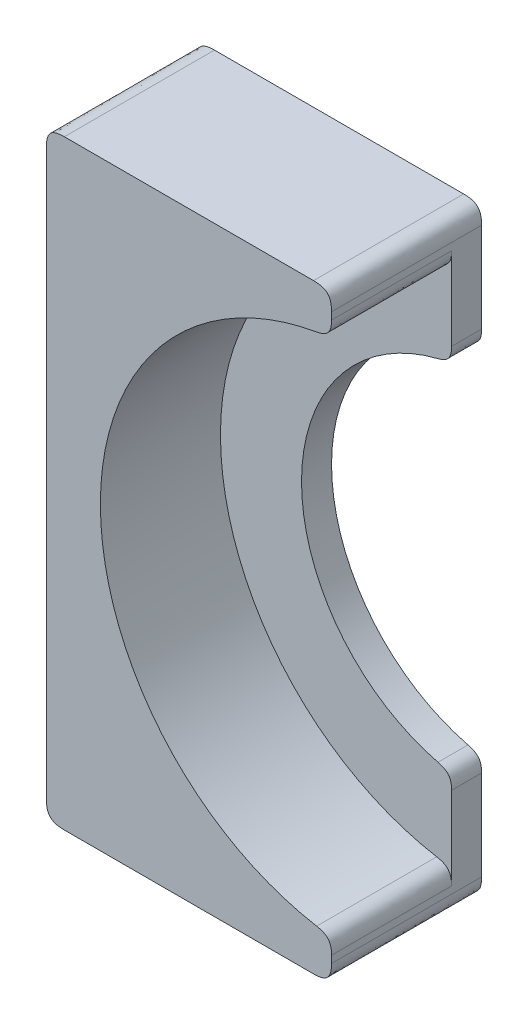
ISO-10303-21;
HEADER;
FILE_DESCRIPTION(('STEP AP214'),'2;1');
FILE_NAME('part.step','',(''),(''),'','','');
FILE_SCHEMA(('AUTOMOTIVE_DESIGN { 1 0 10303 214 1 1 1 1 }'));
ENDSEC;
DATA;
#1=APPLICATION_CONTEXT('core data for automotive mechanical design processes');
#2=APPLICATION_PROTOCOL_DEFINITION('international standard','automotive_design',2000,#1);
#3=PRODUCT_CONTEXT('',#1,'mechanical');
#4=PRODUCT('Part','Part','',(#3));
#5=PRODUCT_RELATED_PRODUCT_CATEGORY('part','',(#4));
#6=PRODUCT_DEFINITION_FORMATION('','',#4);
#7=PRODUCT_DEFINITION_CONTEXT('part definition',#1,'design');
#8=PRODUCT_DEFINITION('design','',#6,#7);
#9=PRODUCT_DEFINITION_SHAPE('','',#8);
#10=(LENGTH_UNIT() NAMED_UNIT(*) SI_UNIT(.MILLI.,.METRE.));
#11=(NAMED_UNIT(*) PLANE_ANGLE_UNIT() SI_UNIT($,.RADIAN.));
#12=(NAMED_UNIT(*) SI_UNIT($,.STERADIAN.) SOLID_ANGLE_UNIT());
#13=UNCERTAINTY_MEASURE_WITH_UNIT(LENGTH_MEASURE(1.E-05),#10,'distance_accuracy_value','');
#14=(GEOMETRIC_REPRESENTATION_CONTEXT(3) GLOBAL_UNCERTAINTY_ASSIGNED_CONTEXT((#13)) GLOBAL_UNIT_ASSIGNED_CONTEXT((#10,
#11,#12)) REPRESENTATION_CONTEXT('',''));
#15=CARTESIAN_POINT('',(0.,0.,0.));
#16=DIRECTION('',(0.,0.,1.));
#17=DIRECTION('',(1.,0.,0.));
#18=AXIS2_PLACEMENT_3D('',#15,#16,#17);
#19=CARTESIAN_POINT('',(0.,0.,25.));
#20=DIRECTION('',(0.,0.,-1.));
#21=DIRECTION('',(-1.,0.,0.));
#22=AXIS2_PLACEMENT_3D('',#19,#20,#21);
#23=CYLINDRICAL_SURFACE('',#22,43.5);
#24=CARTESIAN_POINT('',(0.,0.,5.));
#25=DIRECTION('',(0.,0.,1.));
#26=DIRECTION('',(1.,0.,0.));
#27=AXIS2_PLACEMENT_3D('',#24,#25,#26);
#28=CIRCLE('',#27,43.5);
#29=CARTESIAN_POINT('',(-7.48387096774193,42.85139058815,5.));
#30=VERTEX_POINT('',#29);
#31=CARTESIAN_POINT('',(-7.48387096774192,-42.85139058815,5.));
#32=VERTEX_POINT('',#31);
#33=EDGE_CURVE('E428',#30,#32,#28,.T.);
#34=ORIENTED_EDGE('',*,*,#33,.F.);
#35=CARTESIAN_POINT('',(-7.48387096774193,42.85139058815,26.));
#36=CARTESIAN_POINT('',(-7.48387096774193,42.85139058815,18.6666666666666));
#37=CARTESIAN_POINT('',(-7.48387096774193,42.85139058815,11.3333333333334));
#38=CARTESIAN_POINT('',(-7.48387096774193,42.85139058815,4.));
#39=(BOUNDED_CURVE() B_SPLINE_CURVE(3,(#35,#36,#37,#38),.UNSPECIFIED.,.F.,
.F.) B_SPLINE_CURVE_WITH_KNOTS((4,4),(-0.001,0.021),
.UNSPECIFIED.) CURVE() GEOMETRIC_REPRESENTATION_ITEM() RATIONAL_B_SPLINE_CURVE((1.,1.,1.,1.)) REPRESENTATION_ITEM(''));
#40=CARTESIAN_POINT('',(-7.48387096774193,42.85139058815,25.));
#41=VERTEX_POINT('',#40);
#42=EDGE_CURVE('E550',#30,#41,#39,.F.);
#43=ORIENTED_EDGE('',*,*,#42,.T.);
#44=CARTESIAN_POINT('',(0.,0.,25.));
#45=DIRECTION('',(0.,0.,1.));
#46=DIRECTION('',(1.,0.,0.));
#47=AXIS2_PLACEMENT_3D('',#44,#45,#46);
#48=CIRCLE('',#47,43.5);
#49=CARTESIAN_POINT('',(-7.48387096774192,-42.85139058815,25.));
#50=VERTEX_POINT('',#49);
#51=EDGE_CURVE('E194',#41,#50,#48,.T.);
#52=ORIENTED_EDGE('',*,*,#51,.T.);
#53=CARTESIAN_POINT('',(-7.48387096774192,-42.85139058815,4.));
#54=CARTESIAN_POINT('',(-7.48387096774192,-42.85139058815,11.3333333333334));
#55=CARTESIAN_POINT('',(-7.48387096774192,-42.85139058815,18.6666666666666));
#56=CARTESIAN_POINT('',(-7.48387096774192,-42.85139058815,26.));
#57=(BOUNDED_CURVE() B_SPLINE_CURVE(3,(#53,#54,#55,#56),.UNSPECIFIED.,.F.,
.F.) B_SPLINE_CURVE_WITH_KNOTS((4,4),(-0.001,0.021),
.UNSPECIFIED.) CURVE() GEOMETRIC_REPRESENTATION_ITEM() RATIONAL_B_SPLINE_CURVE((1.,1.,1.,1.)) REPRESENTATION_ITEM(''));
#58=EDGE_CURVE('E547',#50,#32,#57,.F.);
#59=ORIENTED_EDGE('',*,*,#58,.T.);
#60=EDGE_LOOP('',(#34,#43,#52,#59));
#61=FACE_BOUND('',#60,.T.);
#62=ADVANCED_FACE('F39',(#61),#23,.F.);
#63=CARTESIAN_POINT('',(-4.99999999999999,0.,25.));
#64=DIRECTION('',(-1.,0.,0.));
#65=DIRECTION('',(0.,-1.,0.));
#66=AXIS2_PLACEMENT_3D('',#63,#64,#65);
#67=PLANE('',#66);
#68=DIRECTION('',(0.,1.,0.));
#69=VECTOR('',#68,1.);
#70=CARTESIAN_POINT('',(-4.99999999999999,0.,0.));
#71=LINE('',#70,#69);
#72=CARTESIAN_POINT('',(-5.,32.0156211871642,0.));
#73=VERTEX_POINT('',#72);
#74=CARTESIAN_POINT('',(-5.,47.,0.));
#75=VERTEX_POINT('',#74);
#76=EDGE_CURVE('E216',#73,#75,#71,.T.);
#77=ORIENTED_EDGE('',*,*,#76,.T.);
#78=CARTESIAN_POINT('',(-5.,47.,26.25));
#79=CARTESIAN_POINT('',(-5.,47.,17.0833333333333));
#80=CARTESIAN_POINT('',(-5.,47.,7.91666666666667));
#81=CARTESIAN_POINT('',(-5.,47.,-1.25));
#82=(BOUNDED_CURVE() B_SPLINE_CURVE(3,(#78,#79,#80,#81),.UNSPECIFIED.,.F.,
.F.) B_SPLINE_CURVE_WITH_KNOTS((4,4),(-0.02625,0.00125),
.UNSPECIFIED.) CURVE() GEOMETRIC_REPRESENTATION_ITEM() RATIONAL_B_SPLINE_CURVE((1.,1.,1.,1.)) REPRESENTATION_ITEM(''));
#83=CARTESIAN_POINT('',(-5.,47.,25.));
#84=VERTEX_POINT('',#83);
#85=EDGE_CURVE('E551',#75,#84,#82,.F.);
#86=ORIENTED_EDGE('',*,*,#85,.T.);
#87=DIRECTION('',(0.,1.,0.));
#88=VECTOR('',#87,1.);
#89=CARTESIAN_POINT('',(-4.99999999999999,0.,25.));
#90=LINE('',#89,#88);
#91=CARTESIAN_POINT('',(-5.,45.8066589045741,25.));
#92=VERTEX_POINT('',#91);
#93=EDGE_CURVE('E316',#92,#84,#90,.T.);
#94=ORIENTED_EDGE('',*,*,#93,.F.);
#95=CARTESIAN_POINT('',(-5.,45.8066589045741,4.));
#96=CARTESIAN_POINT('',(-5.,45.8066589045741,11.3333333333334));
#97=CARTESIAN_POINT('',(-5.,45.8066589045741,18.6666666666666));
#98=CARTESIAN_POINT('',(-5.,45.8066589045741,26.));
#99=(BOUNDED_CURVE() B_SPLINE_CURVE(3,(#95,#96,#97,#98),.UNSPECIFIED.,.F.,
.F.) B_SPLINE_CURVE_WITH_KNOTS((4,4),(-0.001,0.021),
.UNSPECIFIED.) CURVE() GEOMETRIC_REPRESENTATION_ITEM() RATIONAL_B_SPLINE_CURVE((1.,1.,1.,1.)) REPRESENTATION_ITEM(''));
#100=CARTESIAN_POINT('',(-5.,45.8066589045741,5.));
#101=VERTEX_POINT('',#100);
#102=EDGE_CURVE('E553',#92,#101,#99,.F.);
#103=ORIENTED_EDGE('',*,*,#102,.T.);
#104=DIRECTION('',(0.,1.,0.));
#105=VECTOR('',#104,1.);
#106=CARTESIAN_POINT('',(-4.99999999999999,0.,5.));
#107=LINE('',#106,#105);
#108=CARTESIAN_POINT('',(-5.,32.0156211871643,5.));
#109=VERTEX_POINT('',#108);
#110=EDGE_CURVE('E420',#109,#101,#107,.T.);
#111=ORIENTED_EDGE('',*,*,#110,.F.);
#112=CARTESIAN_POINT('',(-5.,32.0156211871642,-0.25));
#113=CARTESIAN_POINT('',(-5.,32.0156211871642,1.58333333333334));
#114=CARTESIAN_POINT('',(-5.,32.0156211871642,3.41666666666666));
#115=CARTESIAN_POINT('',(-5.,32.0156211871642,5.25));
#116=(BOUNDED_CURVE() B_SPLINE_CURVE(3,(#112,#113,#114,#115),.UNSPECIFIED.,.F.,
.F.) B_SPLINE_CURVE_WITH_KNOTS((4,4),(-0.00025,0.00525),
.UNSPECIFIED.) CURVE() GEOMETRIC_REPRESENTATION_ITEM() RATIONAL_B_SPLINE_CURVE((1.,1.,1.,1.)) REPRESENTATION_ITEM(''));
#117=EDGE_CURVE('E559',#109,#73,#116,.F.);
#118=ORIENTED_EDGE('',*,*,#117,.T.);
#119=EDGE_LOOP('',(#77,#86,#94,#103,#111,#118));
#120=FACE_BOUND('',#119,.T.);
#121=ADVANCED_FACE('F875',(#120),#67,.F.);
#122=CARTESIAN_POINT('',(0.,50.,25.));
#123=DIRECTION('',(0.,1.,0.));
#124=DIRECTION('',(-1.,0.,0.));
#125=AXIS2_PLACEMENT_3D('',#122,#123,#124);
#126=PLANE('',#125);
#127=DIRECTION('',(1.,0.,0.));
#128=VECTOR('',#127,1.);
#129=CARTESIAN_POINT('',(0.,50.,0.));
#130=LINE('',#129,#128);
#131=CARTESIAN_POINT('',(-49.5,50.,0.));
#132=VERTEX_POINT('',#131);
#133=CARTESIAN_POINT('',(-8.,50.,0.));
#134=VERTEX_POINT('',#133);
#135=EDGE_CURVE('E196',#132,#134,#130,.T.);
#136=ORIENTED_EDGE('',*,*,#135,.F.);
#137=CARTESIAN_POINT('',(-49.5,50.,26.25));
#138=CARTESIAN_POINT('',(-49.5,50.,17.0833333333333));
#139=CARTESIAN_POINT('',(-49.5,50.,7.91666666666667));
#140=CARTESIAN_POINT('',(-49.5,50.,-1.25));
#141=(BOUNDED_CURVE() B_SPLINE_CURVE(3,(#137,#138,#139,#140),.UNSPECIFIED.,.F.,
.F.) B_SPLINE_CURVE_WITH_KNOTS((4,4),(-0.02625,0.00125),
.UNSPECIFIED.) CURVE() GEOMETRIC_REPRESENTATION_ITEM() RATIONAL_B_SPLINE_CURVE((1.,1.,1.,1.)) REPRESENTATION_ITEM(''));
#142=CARTESIAN_POINT('',(-49.5,50.,25.));
#143=VERTEX_POINT('',#142);
#144=EDGE_CURVE('E416',#132,#143,#141,.F.);
#145=ORIENTED_EDGE('',*,*,#144,.T.);
#146=DIRECTION('',(1.,0.,0.));
#147=VECTOR('',#146,1.);
#148=CARTESIAN_POINT('',(0.,50.,25.));
#149=LINE('',#148,#147);
#150=CARTESIAN_POINT('',(-8.,50.,25.));
#151=VERTEX_POINT('',#150);
#152=EDGE_CURVE('E280',#143,#151,#149,.T.);
#153=ORIENTED_EDGE('',*,*,#152,.T.);
#154=CARTESIAN_POINT('',(-8.,50.,-1.25));
#155=CARTESIAN_POINT('',(-8.,50.,7.91666666666667));
#156=CARTESIAN_POINT('',(-8.,50.,17.0833333333333));
#157=CARTESIAN_POINT('',(-8.,50.,26.25));
#158=(BOUNDED_CURVE() B_SPLINE_CURVE(3,(#154,#155,#156,#157),.UNSPECIFIED.,.F.,
.F.) B_SPLINE_CURVE_WITH_KNOTS((4,4),(-0.02625,0.00125),
.UNSPECIFIED.) CURVE() GEOMETRIC_REPRESENTATION_ITEM() RATIONAL_B_SPLINE_CURVE((1.,1.,1.,1.)) REPRESENTATION_ITEM(''));
#159=EDGE_CURVE('E405',#151,#134,#158,.F.);
#160=ORIENTED_EDGE('',*,*,#159,.T.);
#161=EDGE_LOOP('',(#136,#145,#153,#160));
#162=FACE_BOUND('',#161,.T.);
#163=ADVANCED_FACE('F300',(#162),#126,.T.);
#164=CARTESIAN_POINT('',(-52.5,0.,25.));
#165=DIRECTION('',(1.,0.,0.));
#166=DIRECTION('',(0.,1.,0.));
#167=AXIS2_PLACEMENT_3D('',#164,#165,#166);
#168=PLANE('',#167);
#169=DIRECTION('',(0.,-1.,0.));
#170=VECTOR('',#169,1.);
#171=CARTESIAN_POINT('',(-52.5,0.,0.));
#172=LINE('',#171,#170);
#173=CARTESIAN_POINT('',(-52.5,47.,0.));
#174=VERTEX_POINT('',#173);
#175=CARTESIAN_POINT('',(-52.5,-47.,0.));
#176=VERTEX_POINT('',#175);
#177=EDGE_CURVE('E192',#174,#176,#172,.T.);
#178=ORIENTED_EDGE('',*,*,#177,.T.);
#179=CARTESIAN_POINT('',(-52.5,-47.,26.25));
#180=CARTESIAN_POINT('',(-52.5,-47.,17.0833333333333));
#181=CARTESIAN_POINT('',(-52.5,-47.,7.91666666666666));
#182=CARTESIAN_POINT('',(-52.5,-47.,-1.25));
#183=(BOUNDED_CURVE() B_SPLINE_CURVE(3,(#179,#180,#181,#182),.UNSPECIFIED.,.F.,
.F.) B_SPLINE_CURVE_WITH_KNOTS((4,4),(-0.00125,0.02625),
.UNSPECIFIED.) CURVE() GEOMETRIC_REPRESENTATION_ITEM() RATIONAL_B_SPLINE_CURVE((1.,1.,1.,1.)) REPRESENTATION_ITEM(''));
#184=CARTESIAN_POINT('',(-52.5,-47.,25.));
#185=VERTEX_POINT('',#184);
#186=EDGE_CURVE('E164',#176,#185,#183,.F.);
#187=ORIENTED_EDGE('',*,*,#186,.T.);
#188=DIRECTION('',(0.,-1.,0.));
#189=VECTOR('',#188,1.);
#190=CARTESIAN_POINT('',(-52.5,0.,25.));
#191=LINE('',#190,#189);
#192=CARTESIAN_POINT('',(-52.5,47.,25.));
#193=VERTEX_POINT('',#192);
#194=EDGE_CURVE('E205',#193,#185,#191,.T.);
#195=ORIENTED_EDGE('',*,*,#194,.F.);
#196=CARTESIAN_POINT('',(-52.5,47.,-1.25));
#197=CARTESIAN_POINT('',(-52.5,47.,7.91666666666667));
#198=CARTESIAN_POINT('',(-52.5,47.,17.0833333333333));
#199=CARTESIAN_POINT('',(-52.5,47.,26.25));
#200=(BOUNDED_CURVE() B_SPLINE_CURVE(3,(#196,#197,#198,#199),.UNSPECIFIED.,.F.,
.F.) B_SPLINE_CURVE_WITH_KNOTS((4,4),(-0.02625,0.00125),
.UNSPECIFIED.) CURVE() GEOMETRIC_REPRESENTATION_ITEM() RATIONAL_B_SPLINE_CURVE((1.,1.,1.,1.)) REPRESENTATION_ITEM(''));
#201=EDGE_CURVE('E171',#193,#174,#200,.F.);
#202=ORIENTED_EDGE('',*,*,#201,.T.);
#203=EDGE_LOOP('',(#178,#187,#195,#202));
#204=FACE_BOUND('',#203,.T.);
#205=ADVANCED_FACE('F291',(#204),#168,.F.);
#206=CARTESIAN_POINT('',(0.,-50.,25.));
#207=DIRECTION('',(0.,1.,0.));
#208=DIRECTION('',(-1.,0.,0.));
#209=AXIS2_PLACEMENT_3D('',#206,#207,#208);
#210=PLANE('',#209);
#211=DIRECTION('',(1.,0.,0.));
#212=VECTOR('',#211,1.);
#213=CARTESIAN_POINT('',(0.,-50.,25.));
#214=LINE('',#213,#212);
#215=CARTESIAN_POINT('',(-49.5,-50.,25.));
#216=VERTEX_POINT('',#215);
#217=CARTESIAN_POINT('',(-7.99999999999999,-50.,25.));
#218=VERTEX_POINT('',#217);
#219=EDGE_CURVE('E183',#216,#218,#214,.T.);
#220=ORIENTED_EDGE('',*,*,#219,.F.);
#221=CARTESIAN_POINT('',(-49.5,-50.,-1.25));
#222=CARTESIAN_POINT('',(-49.5,-50.,7.91666666666666));
#223=CARTESIAN_POINT('',(-49.5,-50.,17.0833333333333));
#224=CARTESIAN_POINT('',(-49.5,-50.,26.25));
#225=(BOUNDED_CURVE() B_SPLINE_CURVE(3,(#221,#222,#223,#224),.UNSPECIFIED.,.F.,
.F.) B_SPLINE_CURVE_WITH_KNOTS((4,4),(-0.00125,0.02625),
.UNSPECIFIED.) CURVE() GEOMETRIC_REPRESENTATION_ITEM() RATIONAL_B_SPLINE_CURVE((1.,1.,1.,1.)) REPRESENTATION_ITEM(''));
#226=CARTESIAN_POINT('',(-49.5,-50.,0.));
#227=VERTEX_POINT('',#226);
#228=EDGE_CURVE('E162',#216,#227,#225,.F.);
#229=ORIENTED_EDGE('',*,*,#228,.T.);
#230=DIRECTION('',(1.,0.,0.));
#231=VECTOR('',#230,1.);
#232=CARTESIAN_POINT('',(0.,-50.,0.));
#233=LINE('',#232,#231);
#234=CARTESIAN_POINT('',(-7.99999999999999,-50.,0.));
#235=VERTEX_POINT('',#234);
#236=EDGE_CURVE('E180',#227,#235,#233,.T.);
#237=ORIENTED_EDGE('',*,*,#236,.T.);
#238=CARTESIAN_POINT('',(-7.99999999999999,-50.,26.25));
#239=CARTESIAN_POINT('',(-7.99999999999999,-50.,17.0833333333333));
#240=CARTESIAN_POINT('',(-7.99999999999999,-50.,7.91666666666666));
#241=CARTESIAN_POINT('',(-7.99999999999999,-50.,-1.25));
#242=(BOUNDED_CURVE() B_SPLINE_CURVE(3,(#238,#239,#240,#241),.UNSPECIFIED.,.F.,
.F.) B_SPLINE_CURVE_WITH_KNOTS((4,4),(-0.00125,0.02625),
.UNSPECIFIED.) CURVE() GEOMETRIC_REPRESENTATION_ITEM() RATIONAL_B_SPLINE_CURVE((1.,1.,1.,1.)) REPRESENTATION_ITEM(''));
#243=EDGE_CURVE('E185',#235,#218,#242,.F.);
#244=ORIENTED_EDGE('',*,*,#243,.T.);
#245=EDGE_LOOP('',(#220,#229,#237,#244));
#246=FACE_BOUND('',#245,.T.);
#247=ADVANCED_FACE('F179',(#246),#210,.F.);
#248=CARTESIAN_POINT('',(-4.99999999999999,-47.,0.));
#249=VERTEX_POINT('',#248);
#250=CARTESIAN_POINT('',(-4.99999999999999,-32.0156211871642,0.));
#251=VERTEX_POINT('',#250);
#252=EDGE_CURVE('E191',#249,#251,#71,.T.);
#253=ORIENTED_EDGE('',*,*,#252,.T.);
#254=CARTESIAN_POINT('',(-4.99999999999999,-32.0156211871642,5.25));
#255=CARTESIAN_POINT('',(-4.99999999999999,-32.0156211871642,3.41666666666666));
#256=CARTESIAN_POINT('',(-4.99999999999999,-32.0156211871642,1.58333333333334));
#257=CARTESIAN_POINT('',(-4.99999999999999,-32.0156211871642,-0.25));
#258=(BOUNDED_CURVE() B_SPLINE_CURVE(3,(#254,#255,#256,#257),.UNSPECIFIED.,.F.,
.F.) B_SPLINE_CURVE_WITH_KNOTS((4,4),(-0.00025,0.00525),
.UNSPECIFIED.) CURVE() GEOMETRIC_REPRESENTATION_ITEM() RATIONAL_B_SPLINE_CURVE((1.,1.,1.,1.)) REPRESENTATION_ITEM(''));
#259=CARTESIAN_POINT('',(-4.99999999999999,-32.0156211871642,5.));
#260=VERTEX_POINT('',#259);
#261=EDGE_CURVE('E64',#251,#260,#258,.F.);
#262=ORIENTED_EDGE('',*,*,#261,.T.);
#263=CARTESIAN_POINT('',(-4.99999999999999,-45.8066589045741,5.));
#264=VERTEX_POINT('',#263);
#265=EDGE_CURVE('E60',#264,#260,#107,.T.);
#266=ORIENTED_EDGE('',*,*,#265,.F.);
#267=CARTESIAN_POINT('',(-4.99999999999999,-45.8066589045741,26.));
#268=CARTESIAN_POINT('',(-4.99999999999999,-45.8066589045741,18.6666666666666));
#269=CARTESIAN_POINT('',(-4.99999999999999,-45.8066589045741,11.3333333333334));
#270=CARTESIAN_POINT('',(-4.99999999999999,-45.8066589045741,4.));
#271=(BOUNDED_CURVE() B_SPLINE_CURVE(3,(#267,#268,#269,#270),.UNSPECIFIED.,.F.,
.F.) B_SPLINE_CURVE_WITH_KNOTS((4,4),(-0.001,0.021),
.UNSPECIFIED.) CURVE() GEOMETRIC_REPRESENTATION_ITEM() RATIONAL_B_SPLINE_CURVE((1.,1.,1.,1.)) REPRESENTATION_ITEM(''));
#272=CARTESIAN_POINT('',(-4.99999999999999,-45.8066589045741,25.));
#273=VERTEX_POINT('',#272);
#274=EDGE_CURVE('E494',#264,#273,#271,.F.);
#275=ORIENTED_EDGE('',*,*,#274,.T.);
#276=CARTESIAN_POINT('',(-4.99999999999999,-47.,25.));
#277=VERTEX_POINT('',#276);
#278=EDGE_CURVE('E204',#277,#273,#90,.T.);
#279=ORIENTED_EDGE('',*,*,#278,.F.);
#280=CARTESIAN_POINT('',(-4.99999999999999,-47.,-1.25));
#281=CARTESIAN_POINT('',(-4.99999999999999,-47.,7.91666666666666));
#282=CARTESIAN_POINT('',(-4.99999999999999,-47.,17.0833333333333));
#283=CARTESIAN_POINT('',(-4.99999999999999,-47.,26.25));
#284=(BOUNDED_CURVE() B_SPLINE_CURVE(3,(#280,#281,#282,#283),.UNSPECIFIED.,.F.,
.F.) B_SPLINE_CURVE_WITH_KNOTS((4,4),(-0.00125,0.02625),
.UNSPECIFIED.) CURVE() GEOMETRIC_REPRESENTATION_ITEM() RATIONAL_B_SPLINE_CURVE((1.,1.,1.,1.)) REPRESENTATION_ITEM(''));
#285=EDGE_CURVE('E499',#277,#249,#284,.F.);
#286=ORIENTED_EDGE('',*,*,#285,.T.);
#287=EDGE_LOOP('',(#253,#262,#266,#275,#279,#286));
#288=FACE_BOUND('',#287,.T.);
#289=ADVANCED_FACE('F242',(#288),#67,.F.);
#290=CARTESIAN_POINT('',(0.,0.,25.));
#291=DIRECTION('',(0.,0.,1.));
#292=DIRECTION('',(1.,0.,0.));
#293=AXIS2_PLACEMENT_3D('',#290,#291,#292);
#294=PLANE('',#293);
#295=ORIENTED_EDGE('',*,*,#194,.T.);
#296=CARTESIAN_POINT('',(-49.5,-50.,25.));
#297=CARTESIAN_POINT('',(-52.5,-50.,25.));
#298=CARTESIAN_POINT('',(-52.5,-47.,25.));
#299=(BOUNDED_CURVE() B_SPLINE_CURVE(2,(#296,#297,#298),.UNSPECIFIED.,.F.,
.F.) B_SPLINE_CURVE_WITH_KNOTS((3,3),(0.,1.),
.UNSPECIFIED.) CURVE() GEOMETRIC_REPRESENTATION_ITEM() RATIONAL_B_SPLINE_CURVE((1.,
1.22222222222222,1.)) REPRESENTATION_ITEM(''));
#300=EDGE_CURVE('E391',#185,#216,#299,.F.);
#301=ORIENTED_EDGE('',*,*,#300,.T.);
#302=ORIENTED_EDGE('',*,*,#219,.T.);
#303=CARTESIAN_POINT('',(-4.99999999999999,-47.,25.));
#304=CARTESIAN_POINT('',(-4.99999999999999,-50.,25.));
#305=CARTESIAN_POINT('',(-7.99999999999999,-50.,25.));
#306=(BOUNDED_CURVE() B_SPLINE_CURVE(2,(#303,#304,#305),.UNSPECIFIED.,.F.,
.F.) B_SPLINE_CURVE_WITH_KNOTS((3,3),(0.,1.),
.UNSPECIFIED.) CURVE() GEOMETRIC_REPRESENTATION_ITEM() RATIONAL_B_SPLINE_CURVE((1.,
1.22222222222222,1.)) REPRESENTATION_ITEM(''));
#307=EDGE_CURVE('E331',#218,#277,#306,.F.);
#308=ORIENTED_EDGE('',*,*,#307,.T.);
#309=ORIENTED_EDGE('',*,*,#278,.T.);
#310=CARTESIAN_POINT('',(-7.48387096774192,-42.85139058815,25.));
#311=CARTESIAN_POINT('',(-4.99999999999999,-43.285191441937,25.));
#312=CARTESIAN_POINT('',(-4.99999999999999,-45.8066589045741,25.));
#313=(BOUNDED_CURVE() B_SPLINE_CURVE(2,(#310,#311,#312),.UNSPECIFIED.,.F.,
.F.) B_SPLINE_CURVE_WITH_KNOTS((3,3),(0.,1.),
.UNSPECIFIED.) CURVE() GEOMETRIC_REPRESENTATION_ITEM() RATIONAL_B_SPLINE_CURVE((1.,
1.22222222222222,1.)) REPRESENTATION_ITEM(''));
#314=EDGE_CURVE('E344',#273,#50,#313,.F.);
#315=ORIENTED_EDGE('',*,*,#314,.T.);
#316=ORIENTED_EDGE('',*,*,#51,.F.);
#317=CARTESIAN_POINT('',(-5.,45.8066589045741,25.));
#318=CARTESIAN_POINT('',(-4.99999999999999,43.285191441937,25.));
#319=CARTESIAN_POINT('',(-7.48387096774193,42.85139058815,25.));
#320=(BOUNDED_CURVE() B_SPLINE_CURVE(2,(#317,#318,#319),.UNSPECIFIED.,.F.,
.F.) B_SPLINE_CURVE_WITH_KNOTS((3,3),(0.,1.),
.UNSPECIFIED.) CURVE() GEOMETRIC_REPRESENTATION_ITEM() RATIONAL_B_SPLINE_CURVE((1.,
1.22222222222222,1.)) REPRESENTATION_ITEM(''));
#321=EDGE_CURVE('E356',#41,#92,#320,.F.);
#322=ORIENTED_EDGE('',*,*,#321,.T.);
#323=ORIENTED_EDGE('',*,*,#93,.T.);
#324=CARTESIAN_POINT('',(-8.,50.,25.));
#325=CARTESIAN_POINT('',(-5.,50.,25.));
#326=CARTESIAN_POINT('',(-5.,47.,25.));
#327=(BOUNDED_CURVE() B_SPLINE_CURVE(2,(#324,#325,#326),.UNSPECIFIED.,.F.,
.F.) B_SPLINE_CURVE_WITH_KNOTS((3,3),(0.,1.),
.UNSPECIFIED.) CURVE() GEOMETRIC_REPRESENTATION_ITEM() RATIONAL_B_SPLINE_CURVE((1.,
1.22222222222222,1.)) REPRESENTATION_ITEM(''));
#328=EDGE_CURVE('E369',#84,#151,#327,.F.);
#329=ORIENTED_EDGE('',*,*,#328,.T.);
#330=ORIENTED_EDGE('',*,*,#152,.F.);
#331=CARTESIAN_POINT('',(-52.5,47.,25.));
#332=CARTESIAN_POINT('',(-52.5,50.,25.));
#333=CARTESIAN_POINT('',(-49.5,50.,25.));
#334=(BOUNDED_CURVE() B_SPLINE_CURVE(2,(#331,#332,#333),.UNSPECIFIED.,.F.,
.F.) B_SPLINE_CURVE_WITH_KNOTS((3,3),(0.,1.),
.UNSPECIFIED.) CURVE() GEOMETRIC_REPRESENTATION_ITEM() RATIONAL_B_SPLINE_CURVE((1.,
1.22222222222222,1.)) REPRESENTATION_ITEM(''));
#335=EDGE_CURVE('E381',#143,#193,#334,.F.);
#336=ORIENTED_EDGE('',*,*,#335,.T.);
#337=EDGE_LOOP('',(#295,#301,#302,#308,#309,#315,#316,#322,#323,#329,#330,#336));
#338=FACE_BOUND('',#337,.T.);
#339=ADVANCED_FACE('F239',(#338),#294,.T.);
#340=CARTESIAN_POINT('',(0.,0.,0.));
#341=DIRECTION('',(0.,0.,1.));
#342=DIRECTION('',(1.,0.,0.));
#343=AXIS2_PLACEMENT_3D('',#340,#341,#342);
#344=PLANE('',#343);
#345=ORIENTED_EDGE('',*,*,#236,.F.);
#346=CARTESIAN_POINT('',(-52.5,-47.,0.));
#347=CARTESIAN_POINT('',(-52.5,-50.,0.));
#348=CARTESIAN_POINT('',(-49.5,-50.,0.));
#349=(BOUNDED_CURVE() B_SPLINE_CURVE(2,(#346,#347,#348),.UNSPECIFIED.,.F.,
.F.) B_SPLINE_CURVE_WITH_KNOTS((3,3),(0.,1.),
.UNSPECIFIED.) CURVE() GEOMETRIC_REPRESENTATION_ITEM() RATIONAL_B_SPLINE_CURVE((1.,
1.22222222222222,1.)) REPRESENTATION_ITEM(''));
#350=EDGE_CURVE('E157',#227,#176,#349,.F.);
#351=ORIENTED_EDGE('',*,*,#350,.T.);
#352=ORIENTED_EDGE('',*,*,#177,.F.);
#353=CARTESIAN_POINT('',(-49.5,50.,0.));
#354=CARTESIAN_POINT('',(-52.5,50.,0.));
#355=CARTESIAN_POINT('',(-52.5,47.,0.));
#356=(BOUNDED_CURVE() B_SPLINE_CURVE(2,(#353,#354,#355),.UNSPECIFIED.,.F.,
.F.) B_SPLINE_CURVE_WITH_KNOTS((3,3),(0.,1.),
.UNSPECIFIED.) CURVE() GEOMETRIC_REPRESENTATION_ITEM() RATIONAL_B_SPLINE_CURVE((1.,
1.22222222222222,1.)) REPRESENTATION_ITEM(''));
#357=EDGE_CURVE('E172',#174,#132,#356,.F.);
#358=ORIENTED_EDGE('',*,*,#357,.T.);
#359=ORIENTED_EDGE('',*,*,#135,.T.);
#360=CARTESIAN_POINT('',(-5.,47.,0.));
#361=CARTESIAN_POINT('',(-5.,50.,0.));
#362=CARTESIAN_POINT('',(-8.,50.,0.));
#363=(BOUNDED_CURVE() B_SPLINE_CURVE(2,(#360,#361,#362),.UNSPECIFIED.,.F.,
.F.) B_SPLINE_CURVE_WITH_KNOTS((3,3),(0.,1.),
.UNSPECIFIED.) CURVE() GEOMETRIC_REPRESENTATION_ITEM() RATIONAL_B_SPLINE_CURVE((1.,
1.22222222222222,1.)) REPRESENTATION_ITEM(''));
#364=EDGE_CURVE('E651',#134,#75,#363,.F.);
#365=ORIENTED_EDGE('',*,*,#364,.T.);
#366=ORIENTED_EDGE('',*,*,#76,.F.);
#367=CARTESIAN_POINT('',(-7.27272727272727,29.1051101701493,0.));
#368=CARTESIAN_POINT('',(-5.,29.6730147588352,0.));
#369=CARTESIAN_POINT('',(-5.,32.0156211871642,0.));
#370=(BOUNDED_CURVE() B_SPLINE_CURVE(2,(#367,#368,#369),.UNSPECIFIED.,.F.,
.F.) B_SPLINE_CURVE_WITH_KNOTS((3,3),(0.,1.),
.UNSPECIFIED.) CURVE() GEOMETRIC_REPRESENTATION_ITEM() RATIONAL_B_SPLINE_CURVE((1.,
1.22222222222222,1.)) REPRESENTATION_ITEM(''));
#371=CARTESIAN_POINT('',(-7.27272727272727,29.1051101701493,0.));
#372=VERTEX_POINT('',#371);
#373=EDGE_CURVE('E746',#73,#372,#370,.F.);
#374=ORIENTED_EDGE('',*,*,#373,.T.);
#375=CARTESIAN_POINT('',(0.,0.,0.));
#376=DIRECTION('',(0.,0.,1.));
#377=DIRECTION('',(1.,0.,0.));
#378=AXIS2_PLACEMENT_3D('',#375,#376,#377);
#379=CIRCLE('',#378,30.);
#380=CARTESIAN_POINT('',(-7.27272727272726,-29.1051101701493,0.));
#381=VERTEX_POINT('',#380);
#382=EDGE_CURVE('E218',#372,#381,#379,.T.);
#383=ORIENTED_EDGE('',*,*,#382,.T.);
#384=CARTESIAN_POINT('',(-4.99999999999999,-32.0156211871642,0.));
#385=CARTESIAN_POINT('',(-4.99999999999999,-29.6730147588351,0.));
#386=CARTESIAN_POINT('',(-7.27272727272726,-29.1051101701493,0.));
#387=(BOUNDED_CURVE() B_SPLINE_CURVE(2,(#384,#385,#386),.UNSPECIFIED.,.F.,
.F.) B_SPLINE_CURVE_WITH_KNOTS((3,3),(0.,1.),
.UNSPECIFIED.) CURVE() GEOMETRIC_REPRESENTATION_ITEM() RATIONAL_B_SPLINE_CURVE((1.,
1.22222222222222,1.)) REPRESENTATION_ITEM(''));
#388=EDGE_CURVE('E798',#381,#251,#387,.F.);
#389=ORIENTED_EDGE('',*,*,#388,.T.);
#390=ORIENTED_EDGE('',*,*,#252,.F.);
#391=CARTESIAN_POINT('',(-7.99999999999999,-50.,0.));
#392=CARTESIAN_POINT('',(-4.99999999999999,-50.,0.));
#393=CARTESIAN_POINT('',(-4.99999999999999,-47.,0.));
#394=(BOUNDED_CURVE() B_SPLINE_CURVE(2,(#391,#392,#393),.UNSPECIFIED.,.F.,
.F.) B_SPLINE_CURVE_WITH_KNOTS((3,3),(0.,1.),
.UNSPECIFIED.) CURVE() GEOMETRIC_REPRESENTATION_ITEM() RATIONAL_B_SPLINE_CURVE((1.,
1.22222222222222,1.)) REPRESENTATION_ITEM(''));
#395=EDGE_CURVE('E184',#249,#235,#394,.F.);
#396=ORIENTED_EDGE('',*,*,#395,.T.);
#397=EDGE_LOOP('',(#345,#351,#352,#358,#359,#365,#366,#374,#383,#389,#390,#396));
#398=FACE_BOUND('',#397,.T.);
#399=ADVANCED_FACE('F188',(#398),#344,.F.);
#400=CARTESIAN_POINT('',(0.,0.,5.));
#401=DIRECTION('',(0.,0.,-1.));
#402=DIRECTION('',(-1.,0.,0.));
#403=AXIS2_PLACEMENT_3D('',#400,#401,#402);
#404=CYLINDRICAL_SURFACE('',#403,30.);
#405=ORIENTED_EDGE('',*,*,#382,.F.);
#406=CARTESIAN_POINT('',(-7.27272727272727,29.1051101701493,5.25));
#407=CARTESIAN_POINT('',(-7.27272727272727,29.1051101701493,3.41666666666666));
#408=CARTESIAN_POINT('',(-7.27272727272727,29.1051101701493,1.58333333333334));
#409=CARTESIAN_POINT('',(-7.27272727272727,29.1051101701493,-0.25));
#410=(BOUNDED_CURVE() B_SPLINE_CURVE(3,(#406,#407,#408,#409),.UNSPECIFIED.,.F.,
.F.) B_SPLINE_CURVE_WITH_KNOTS((4,4),(-0.00025,0.00525),
.UNSPECIFIED.) CURVE() GEOMETRIC_REPRESENTATION_ITEM() RATIONAL_B_SPLINE_CURVE((1.,1.,1.,1.)) REPRESENTATION_ITEM(''));
#411=CARTESIAN_POINT('',(-7.27272727272727,29.1051101701493,5.));
#412=VERTEX_POINT('',#411);
#413=EDGE_CURVE('E786',#372,#412,#410,.F.);
#414=ORIENTED_EDGE('',*,*,#413,.T.);
#415=CARTESIAN_POINT('',(0.,0.,5.));
#416=DIRECTION('',(0.,0.,1.));
#417=DIRECTION('',(1.,0.,0.));
#418=AXIS2_PLACEMENT_3D('',#415,#416,#417);
#419=CIRCLE('',#418,30.);
#420=CARTESIAN_POINT('',(-7.27272727272726,-29.1051101701493,5.));
#421=VERTEX_POINT('',#420);
#422=EDGE_CURVE('E429',#412,#421,#419,.T.);
#423=ORIENTED_EDGE('',*,*,#422,.T.);
#424=CARTESIAN_POINT('',(-7.27272727272726,-29.1051101701493,-0.25));
#425=CARTESIAN_POINT('',(-7.27272727272726,-29.1051101701493,1.58333333333334));
#426=CARTESIAN_POINT('',(-7.27272727272726,-29.1051101701493,3.41666666666666));
#427=CARTESIAN_POINT('',(-7.27272727272726,-29.1051101701493,5.25));
#428=(BOUNDED_CURVE() B_SPLINE_CURVE(3,(#424,#425,#426,#427),.UNSPECIFIED.,.F.,
.F.) B_SPLINE_CURVE_WITH_KNOTS((4,4),(-0.00025,0.00525),
.UNSPECIFIED.) CURVE() GEOMETRIC_REPRESENTATION_ITEM() RATIONAL_B_SPLINE_CURVE((1.,1.,1.,1.)) REPRESENTATION_ITEM(''));
#429=EDGE_CURVE('E552',#421,#381,#428,.F.);
#430=ORIENTED_EDGE('',*,*,#429,.T.);
#431=EDGE_LOOP('',(#405,#414,#423,#430));
#432=FACE_BOUND('',#431,.T.);
#433=ADVANCED_FACE('F238',(#432),#404,.F.);
#434=CARTESIAN_POINT('',(0.,0.,5.));
#435=DIRECTION('',(0.,0.,1.));
#436=DIRECTION('',(1.,0.,0.));
#437=AXIS2_PLACEMENT_3D('',#434,#435,#436);
#438=PLANE('',#437);
#439=ORIENTED_EDGE('',*,*,#422,.F.);
#440=CARTESIAN_POINT('',(-5.,32.0156211871642,5.));
#441=CARTESIAN_POINT('',(-5.,29.6730147588352,5.));
#442=CARTESIAN_POINT('',(-7.27272727272727,29.1051101701493,5.));
#443=(BOUNDED_CURVE() B_SPLINE_CURVE(2,(#440,#441,#442),.UNSPECIFIED.,.F.,
.F.) B_SPLINE_CURVE_WITH_KNOTS((3,3),(0.,1.),
.UNSPECIFIED.) CURVE() GEOMETRIC_REPRESENTATION_ITEM() RATIONAL_B_SPLINE_CURVE((1.,
1.22222222222222,1.)) REPRESENTATION_ITEM(''));
#444=EDGE_CURVE('E868',#412,#109,#443,.F.);
#445=ORIENTED_EDGE('',*,*,#444,.T.);
#446=ORIENTED_EDGE('',*,*,#110,.T.);
#447=CARTESIAN_POINT('',(-7.48387096774193,42.85139058815,5.));
#448=CARTESIAN_POINT('',(-4.99999999999999,43.285191441937,5.));
#449=CARTESIAN_POINT('',(-5.,45.8066589045741,5.));
#450=(BOUNDED_CURVE() B_SPLINE_CURVE(2,(#447,#448,#449),.UNSPECIFIED.,.F.,
.F.) B_SPLINE_CURVE_WITH_KNOTS((3,3),(0.,1.),
.UNSPECIFIED.) CURVE() GEOMETRIC_REPRESENTATION_ITEM() RATIONAL_B_SPLINE_CURVE((1.,
1.22222222222222,1.)) REPRESENTATION_ITEM(''));
#451=EDGE_CURVE('E53',#101,#30,#450,.F.);
#452=ORIENTED_EDGE('',*,*,#451,.T.);
#453=ORIENTED_EDGE('',*,*,#33,.T.);
#454=CARTESIAN_POINT('',(-4.99999999999999,-45.8066589045741,5.));
#455=CARTESIAN_POINT('',(-4.99999999999999,-43.285191441937,5.));
#456=CARTESIAN_POINT('',(-7.48387096774192,-42.85139058815,5.));
#457=(BOUNDED_CURVE() B_SPLINE_CURVE(2,(#454,#455,#456),.UNSPECIFIED.,.F.,
.F.) B_SPLINE_CURVE_WITH_KNOTS((3,3),(0.,1.),
.UNSPECIFIED.) CURVE() GEOMETRIC_REPRESENTATION_ITEM() RATIONAL_B_SPLINE_CURVE((1.,
1.22222222222222,1.)) REPRESENTATION_ITEM(''));
#458=EDGE_CURVE('E12',#32,#264,#457,.F.);
#459=ORIENTED_EDGE('',*,*,#458,.T.);
#460=ORIENTED_EDGE('',*,*,#265,.T.);
#461=CARTESIAN_POINT('',(-7.27272727272726,-29.1051101701493,5.));
#462=CARTESIAN_POINT('',(-4.99999999999999,-29.6730147588351,5.));
#463=CARTESIAN_POINT('',(-4.99999999999999,-32.0156211871642,5.));
#464=(BOUNDED_CURVE() B_SPLINE_CURVE(2,(#461,#462,#463),.UNSPECIFIED.,.F.,
.F.) B_SPLINE_CURVE_WITH_KNOTS((3,3),(0.,1.),
.UNSPECIFIED.) CURVE() GEOMETRIC_REPRESENTATION_ITEM() RATIONAL_B_SPLINE_CURVE((1.,
1.22222222222222,1.)) REPRESENTATION_ITEM(''));
#465=EDGE_CURVE('E447',#260,#421,#464,.F.);
#466=ORIENTED_EDGE('',*,*,#465,.T.);
#467=EDGE_LOOP('',(#439,#445,#446,#452,#453,#459,#460,#466));
#468=FACE_BOUND('',#467,.T.);
#469=ADVANCED_FACE('F454',(#468),#438,.T.);
#470=CARTESIAN_POINT('',(-49.5,-50.,26.25));
#471=CARTESIAN_POINT('',(-49.5,-50.,17.0833333333333));
#472=CARTESIAN_POINT('',(-49.5,-50.,7.91666666666666));
#473=CARTESIAN_POINT('',(-49.5,-50.,-1.25));
#474=CARTESIAN_POINT('',(-52.5,-50.,26.25));
#475=CARTESIAN_POINT('',(-52.5,-50.,17.0833333333333));
#476=CARTESIAN_POINT('',(-52.5,-50.,7.91666666666667));
#477=CARTESIAN_POINT('',(-52.5,-50.,-1.25));
#478=CARTESIAN_POINT('',(-52.5,-47.,26.25));
#479=CARTESIAN_POINT('',(-52.5,-47.,17.0833333333333));
#480=CARTESIAN_POINT('',(-52.5,-47.,7.91666666666666));
#481=CARTESIAN_POINT('',(-52.5,-47.,-1.25));
#482=(BOUNDED_SURFACE() B_SPLINE_SURFACE(2,3,((#470,#471,#472,#473),(#474,#475,#476,#477),(#478,
#479,#480,#481)),.UNSPECIFIED.,.F.,.F.,.F.) B_SPLINE_SURFACE_WITH_KNOTS((3,3),(4,4),(0.,1.),
(-0.00125,0.02625),
.UNSPECIFIED.) GEOMETRIC_REPRESENTATION_ITEM() RATIONAL_B_SPLINE_SURFACE(((1.,1.,1.,1.),
(1.22222222222222,1.22222222222222,1.22222222222222,1.22222222222222),(1.,1.,1.,1.))) REPRESENTATION_ITEM('') SURFACE());
#483=ORIENTED_EDGE('',*,*,#300,.F.);
#484=ORIENTED_EDGE('',*,*,#186,.F.);
#485=ORIENTED_EDGE('',*,*,#350,.F.);
#486=ORIENTED_EDGE('',*,*,#228,.F.);
#487=EDGE_LOOP('',(#483,#484,#485,#486));
#488=FACE_BOUND('',#487,.T.);
#489=ADVANCED_FACE('F161',(#488),#482,.T.);
#490=CARTESIAN_POINT('',(-49.5,50.,-1.25));
#491=CARTESIAN_POINT('',(-49.5,50.,7.91666666666667));
#492=CARTESIAN_POINT('',(-49.5,50.,17.0833333333333));
#493=CARTESIAN_POINT('',(-49.5,50.,26.25));
#494=CARTESIAN_POINT('',(-52.5,50.,-1.25));
#495=CARTESIAN_POINT('',(-52.5,50.,7.91666666666667));
#496=CARTESIAN_POINT('',(-52.5,50.,17.0833333333333));
#497=CARTESIAN_POINT('',(-52.5,50.,26.25));
#498=CARTESIAN_POINT('',(-52.5,47.,-1.25));
#499=CARTESIAN_POINT('',(-52.5,47.,7.91666666666667));
#500=CARTESIAN_POINT('',(-52.5,47.,17.0833333333333));
#501=CARTESIAN_POINT('',(-52.5,47.,26.25));
#502=(BOUNDED_SURFACE() B_SPLINE_SURFACE(2,3,((#490,#491,#492,#493),(#494,#495,#496,#497),(#498,
#499,#500,#501)),.UNSPECIFIED.,.F.,.F.,.F.) B_SPLINE_SURFACE_WITH_KNOTS((3,3),(4,4),(0.,1.),
(-0.02625,0.00125),
.UNSPECIFIED.) GEOMETRIC_REPRESENTATION_ITEM() RATIONAL_B_SPLINE_SURFACE(((1.,1.,1.,1.),
(1.22222222222222,1.22222222222222,1.22222222222222,1.22222222222222),(1.,1.,1.,1.))) REPRESENTATION_ITEM('') SURFACE());
#503=ORIENTED_EDGE('',*,*,#335,.F.);
#504=ORIENTED_EDGE('',*,*,#144,.F.);
#505=ORIENTED_EDGE('',*,*,#357,.F.);
#506=ORIENTED_EDGE('',*,*,#201,.F.);
#507=EDGE_LOOP('',(#503,#504,#505,#506));
#508=FACE_BOUND('',#507,.T.);
#509=ADVANCED_FACE('F588',(#508),#502,.T.);
#510=CARTESIAN_POINT('',(-5.,47.,-1.25));
#511=CARTESIAN_POINT('',(-5.,47.,7.91666666666667));
#512=CARTESIAN_POINT('',(-5.,47.,17.0833333333333));
#513=CARTESIAN_POINT('',(-5.,47.,26.25));
#514=CARTESIAN_POINT('',(-5.,50.,-1.25));
#515=CARTESIAN_POINT('',(-5.,50.,7.91666666666667));
#516=CARTESIAN_POINT('',(-5.,50.,17.0833333333333));
#517=CARTESIAN_POINT('',(-5.,50.,26.25));
#518=CARTESIAN_POINT('',(-8.,50.,-1.25));
#519=CARTESIAN_POINT('',(-8.,50.,7.91666666666667));
#520=CARTESIAN_POINT('',(-8.,50.,17.0833333333333));
#521=CARTESIAN_POINT('',(-8.,50.,26.25));
#522=(BOUNDED_SURFACE() B_SPLINE_SURFACE(2,3,((#510,#511,#512,#513),(#514,#515,#516,#517),(#518,
#519,#520,#521)),.UNSPECIFIED.,.F.,.F.,.F.) B_SPLINE_SURFACE_WITH_KNOTS((3,3),(4,4),(0.,1.),
(-0.02625,0.00125),
.UNSPECIFIED.) GEOMETRIC_REPRESENTATION_ITEM() RATIONAL_B_SPLINE_SURFACE(((1.,1.,1.,1.),
(1.22222222222222,1.22222222222222,1.22222222222222,1.22222222222222),(1.,1.,1.,1.))) REPRESENTATION_ITEM('') SURFACE());
#523=ORIENTED_EDGE('',*,*,#328,.F.);
#524=ORIENTED_EDGE('',*,*,#85,.F.);
#525=ORIENTED_EDGE('',*,*,#364,.F.);
#526=ORIENTED_EDGE('',*,*,#159,.F.);
#527=EDGE_LOOP('',(#523,#524,#525,#526));
#528=FACE_BOUND('',#527,.T.);
#529=ADVANCED_FACE('F657',(#528),#522,.T.);
#530=CARTESIAN_POINT('',(-5.,45.8066589045741,26.));
#531=CARTESIAN_POINT('',(-5.,45.8066589045741,18.6666666666666));
#532=CARTESIAN_POINT('',(-5.,45.8066589045741,11.3333333333334));
#533=CARTESIAN_POINT('',(-5.,45.8066589045741,4.));
#534=CARTESIAN_POINT('',(-4.99999999999999,43.285191441937,26.));
#535=CARTESIAN_POINT('',(-4.99999999999999,43.285191441937,18.6666666666666));
#536=CARTESIAN_POINT('',(-4.99999999999999,43.285191441937,11.3333333333334));
#537=CARTESIAN_POINT('',(-4.99999999999999,43.285191441937,4.));
#538=CARTESIAN_POINT('',(-7.48387096774193,42.85139058815,26.));
#539=CARTESIAN_POINT('',(-7.48387096774193,42.85139058815,18.6666666666666));
#540=CARTESIAN_POINT('',(-7.48387096774193,42.85139058815,11.3333333333334));
#541=CARTESIAN_POINT('',(-7.48387096774193,42.85139058815,4.));
#542=(BOUNDED_SURFACE() B_SPLINE_SURFACE(2,3,((#530,#531,#532,#533),(#534,#535,#536,#537),(#538,
#539,#540,#541)),.UNSPECIFIED.,.F.,.F.,.F.) B_SPLINE_SURFACE_WITH_KNOTS((3,3),(4,4),(0.,1.),
(-0.001,0.021),.UNSPECIFIED.) GEOMETRIC_REPRESENTATION_ITEM() RATIONAL_B_SPLINE_SURFACE(((1.,1.,
1.,1.),(1.22222222222222,1.22222222222222,1.22222222222222,1.22222222222222),(1.,1.,1.,1.))) REPRESENTATION_ITEM('') SURFACE());
#543=ORIENTED_EDGE('',*,*,#321,.F.);
#544=ORIENTED_EDGE('',*,*,#42,.F.);
#545=ORIENTED_EDGE('',*,*,#451,.F.);
#546=ORIENTED_EDGE('',*,*,#102,.F.);
#547=EDGE_LOOP('',(#543,#544,#545,#546));
#548=FACE_BOUND('',#547,.T.);
#549=ADVANCED_FACE('F671',(#548),#542,.T.);
#550=CARTESIAN_POINT('',(-5.,32.0156211871642,5.25));
#551=CARTESIAN_POINT('',(-5.,32.0156211871642,3.41666666666666));
#552=CARTESIAN_POINT('',(-5.,32.0156211871642,1.58333333333334));
#553=CARTESIAN_POINT('',(-5.,32.0156211871642,-0.25));
#554=CARTESIAN_POINT('',(-5.,29.6730147588352,5.25));
#555=CARTESIAN_POINT('',(-5.,29.6730147588352,3.41666666666666));
#556=CARTESIAN_POINT('',(-5.,29.6730147588352,1.58333333333334));
#557=CARTESIAN_POINT('',(-5.,29.6730147588352,-0.25));
#558=CARTESIAN_POINT('',(-7.27272727272727,29.1051101701493,5.25));
#559=CARTESIAN_POINT('',(-7.27272727272727,29.1051101701493,3.41666666666666));
#560=CARTESIAN_POINT('',(-7.27272727272727,29.1051101701493,1.58333333333334));
#561=CARTESIAN_POINT('',(-7.27272727272727,29.1051101701493,-0.25));
#562=(BOUNDED_SURFACE() B_SPLINE_SURFACE(2,3,((#550,#551,#552,#553),(#554,#555,#556,#557),(#558,
#559,#560,#561)),.UNSPECIFIED.,.F.,.F.,.F.) B_SPLINE_SURFACE_WITH_KNOTS((3,3),(4,4),(0.,1.),
(-0.00025,0.00525),
.UNSPECIFIED.) GEOMETRIC_REPRESENTATION_ITEM() RATIONAL_B_SPLINE_SURFACE(((1.,1.,1.,1.),
(1.22222222222222,1.22222222222222,1.22222222222222,1.22222222222222),(1.,1.,1.,1.))) REPRESENTATION_ITEM('') SURFACE());
#563=ORIENTED_EDGE('',*,*,#444,.F.);
#564=ORIENTED_EDGE('',*,*,#413,.F.);
#565=ORIENTED_EDGE('',*,*,#373,.F.);
#566=ORIENTED_EDGE('',*,*,#117,.F.);
#567=EDGE_LOOP('',(#563,#564,#565,#566));
#568=FACE_BOUND('',#567,.T.);
#569=ADVANCED_FACE('F752',(#568),#562,.T.);
#570=CARTESIAN_POINT('',(-7.27272727272726,-29.1051101701493,5.25));
#571=CARTESIAN_POINT('',(-7.27272727272726,-29.1051101701493,3.41666666666666));
#572=CARTESIAN_POINT('',(-7.27272727272726,-29.1051101701493,1.58333333333334));
#573=CARTESIAN_POINT('',(-7.27272727272726,-29.1051101701493,-0.25));
#574=CARTESIAN_POINT('',(-4.99999999999999,-29.6730147588351,5.25));
#575=CARTESIAN_POINT('',(-4.99999999999999,-29.6730147588351,3.41666666666666));
#576=CARTESIAN_POINT('',(-4.99999999999999,-29.6730147588351,1.58333333333334));
#577=CARTESIAN_POINT('',(-4.99999999999999,-29.6730147588351,-0.25));
#578=CARTESIAN_POINT('',(-4.99999999999999,-32.0156211871642,5.25));
#579=CARTESIAN_POINT('',(-4.99999999999999,-32.0156211871642,3.41666666666666));
#580=CARTESIAN_POINT('',(-4.99999999999999,-32.0156211871642,1.58333333333334));
#581=CARTESIAN_POINT('',(-4.99999999999999,-32.0156211871642,-0.25));
#582=(BOUNDED_SURFACE() B_SPLINE_SURFACE(2,3,((#570,#571,#572,#573),(#574,#575,#576,#577),(#578,
#579,#580,#581)),.UNSPECIFIED.,.F.,.F.,.F.) B_SPLINE_SURFACE_WITH_KNOTS((3,3),(4,4),(0.,1.),
(-0.00025,0.00525),
.UNSPECIFIED.) GEOMETRIC_REPRESENTATION_ITEM() RATIONAL_B_SPLINE_SURFACE(((1.,1.,1.,1.),
(1.22222222222222,1.22222222222222,1.22222222222222,1.22222222222222),(1.,1.,1.,1.))) REPRESENTATION_ITEM('') SURFACE());
#583=ORIENTED_EDGE('',*,*,#465,.F.);
#584=ORIENTED_EDGE('',*,*,#261,.F.);
#585=ORIENTED_EDGE('',*,*,#388,.F.);
#586=ORIENTED_EDGE('',*,*,#429,.F.);
#587=EDGE_LOOP('',(#583,#584,#585,#586));
#588=FACE_BOUND('',#587,.T.);
#589=ADVANCED_FACE('F522',(#588),#582,.T.);
#590=CARTESIAN_POINT('',(-7.48387096774192,-42.85139058815,26.));
#591=CARTESIAN_POINT('',(-7.48387096774192,-42.85139058815,18.6666666666666));
#592=CARTESIAN_POINT('',(-7.48387096774192,-42.85139058815,11.3333333333334));
#593=CARTESIAN_POINT('',(-7.48387096774192,-42.85139058815,4.));
#594=CARTESIAN_POINT('',(-4.99999999999999,-43.285191441937,26.));
#595=CARTESIAN_POINT('',(-4.99999999999999,-43.285191441937,18.6666666666666));
#596=CARTESIAN_POINT('',(-4.99999999999999,-43.285191441937,11.3333333333334));
#597=CARTESIAN_POINT('',(-4.99999999999999,-43.285191441937,4.));
#598=CARTESIAN_POINT('',(-4.99999999999999,-45.8066589045741,26.));
#599=CARTESIAN_POINT('',(-4.99999999999999,-45.8066589045741,18.6666666666666));
#600=CARTESIAN_POINT('',(-4.99999999999999,-45.8066589045741,11.3333333333334));
#601=CARTESIAN_POINT('',(-4.99999999999999,-45.8066589045741,4.));
#602=(BOUNDED_SURFACE() B_SPLINE_SURFACE(2,3,((#590,#591,#592,#593),(#594,#595,#596,#597),(#598,
#599,#600,#601)),.UNSPECIFIED.,.F.,.F.,.F.) B_SPLINE_SURFACE_WITH_KNOTS((3,3),(4,4),(0.,1.),
(-0.001,0.021),.UNSPECIFIED.) GEOMETRIC_REPRESENTATION_ITEM() RATIONAL_B_SPLINE_SURFACE(((1.,1.,
1.,1.),(1.22222222222222,1.22222222222222,1.22222222222222,1.22222222222222),(1.,1.,1.,1.))) REPRESENTATION_ITEM('') SURFACE());
#603=ORIENTED_EDGE('',*,*,#314,.F.);
#604=ORIENTED_EDGE('',*,*,#274,.F.);
#605=ORIENTED_EDGE('',*,*,#458,.F.);
#606=ORIENTED_EDGE('',*,*,#58,.F.);
#607=EDGE_LOOP('',(#603,#604,#605,#606));
#608=FACE_BOUND('',#607,.T.);
#609=ADVANCED_FACE('F496',(#608),#602,.T.);
#610=CARTESIAN_POINT('',(-4.99999999999999,-47.,26.25));
#611=CARTESIAN_POINT('',(-4.99999999999999,-47.,17.0833333333333));
#612=CARTESIAN_POINT('',(-4.99999999999999,-47.,7.91666666666666));
#613=CARTESIAN_POINT('',(-4.99999999999999,-47.,-1.25));
#614=CARTESIAN_POINT('',(-4.99999999999999,-50.,26.25));
#615=CARTESIAN_POINT('',(-4.99999999999999,-50.,17.0833333333333));
#616=CARTESIAN_POINT('',(-4.99999999999999,-50.,7.91666666666667));
#617=CARTESIAN_POINT('',(-4.99999999999999,-50.,-1.25));
#618=CARTESIAN_POINT('',(-7.99999999999999,-50.,26.25));
#619=CARTESIAN_POINT('',(-7.99999999999999,-50.,17.0833333333333));
#620=CARTESIAN_POINT('',(-7.99999999999999,-50.,7.91666666666666));
#621=CARTESIAN_POINT('',(-7.99999999999999,-50.,-1.25));
#622=(BOUNDED_SURFACE() B_SPLINE_SURFACE(2,3,((#610,#611,#612,#613),(#614,#615,#616,#617),(#618,
#619,#620,#621)),.UNSPECIFIED.,.F.,.F.,.F.) B_SPLINE_SURFACE_WITH_KNOTS((3,3),(4,4),(0.,1.),
(-0.00125,0.02625),
.UNSPECIFIED.) GEOMETRIC_REPRESENTATION_ITEM() RATIONAL_B_SPLINE_SURFACE(((1.,1.,1.,1.),
(1.22222222222222,1.22222222222222,1.22222222222222,1.22222222222222),(1.,1.,1.,1.))) REPRESENTATION_ITEM('') SURFACE());
#623=ORIENTED_EDGE('',*,*,#307,.F.);
#624=ORIENTED_EDGE('',*,*,#243,.F.);
#625=ORIENTED_EDGE('',*,*,#395,.F.);
#626=ORIENTED_EDGE('',*,*,#285,.F.);
#627=EDGE_LOOP('',(#623,#624,#625,#626));
#628=FACE_BOUND('',#627,.T.);
#629=ADVANCED_FACE('F42',(#628),#622,.T.);
#630=CLOSED_SHELL('',(#62,#121,#163,#205,#247,#289,#339,#399,#433,#469,#489,#509,#529,#549,#569,
#589,#609,#629));
#631=MANIFOLD_SOLID_BREP('B2',#630);
#632=ADVANCED_BREP_SHAPE_REPRESENTATION('',(#18,#631),#14);
#633=SHAPE_DEFINITION_REPRESENTATION(#9,#632);
ENDSEC;
END-ISO-10303-21;
